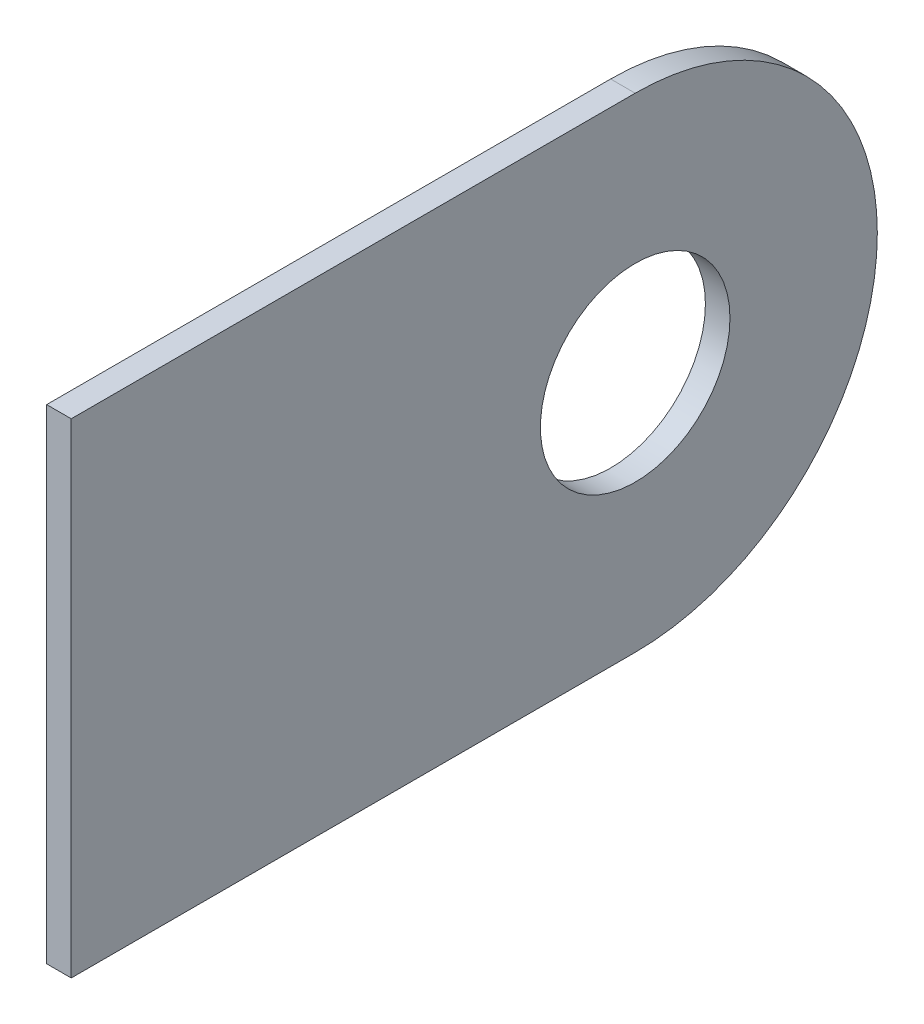
ISO-10303-21;
HEADER;
FILE_DESCRIPTION(('STEP AP214'),'2;1');
FILE_NAME('part.step','',(''),(''),'','','');
FILE_SCHEMA(('AUTOMOTIVE_DESIGN { 1 0 10303 214 1 1 1 1 }'));
ENDSEC;
DATA;
#1=APPLICATION_CONTEXT('core data for automotive mechanical design processes');
#2=APPLICATION_PROTOCOL_DEFINITION('international standard','automotive_design',2000,#1);
#3=PRODUCT_CONTEXT('',#1,'mechanical');
#4=PRODUCT('Part','Part','',(#3));
#5=PRODUCT_RELATED_PRODUCT_CATEGORY('part','',(#4));
#6=PRODUCT_DEFINITION_FORMATION('','',#4);
#7=PRODUCT_DEFINITION_CONTEXT('part definition',#1,'design');
#8=PRODUCT_DEFINITION('design','',#6,#7);
#9=PRODUCT_DEFINITION_SHAPE('','',#8);
#10=(LENGTH_UNIT() NAMED_UNIT(*) SI_UNIT(.MILLI.,.METRE.));
#11=(NAMED_UNIT(*) PLANE_ANGLE_UNIT() SI_UNIT($,.RADIAN.));
#12=(NAMED_UNIT(*) SI_UNIT($,.STERADIAN.) SOLID_ANGLE_UNIT());
#13=UNCERTAINTY_MEASURE_WITH_UNIT(LENGTH_MEASURE(1.E-05),#10,'distance_accuracy_value','');
#14=(GEOMETRIC_REPRESENTATION_CONTEXT(3) GLOBAL_UNCERTAINTY_ASSIGNED_CONTEXT((#13)) GLOBAL_UNIT_ASSIGNED_CONTEXT((#10,
#11,#12)) REPRESENTATION_CONTEXT('',''));
#15=CARTESIAN_POINT('',(0.,0.,0.));
#16=DIRECTION('',(0.,0.,1.));
#17=DIRECTION('',(1.,0.,0.));
#18=AXIS2_PLACEMENT_3D('',#15,#16,#17);
#19=CARTESIAN_POINT('',(-3.125,0.,-10.2017700022388));
#20=DIRECTION('',(1.,0.,0.));
#21=DIRECTION('',(0.,0.,-1.));
#22=AXIS2_PLACEMENT_3D('',#19,#20,#21);
#23=CYLINDRICAL_SURFACE('',#22,36.975);
#24=CARTESIAN_POINT('',(0.625,0.,-10.2017700022388));
#25=DIRECTION('',(1.,0.,0.));
#26=DIRECTION('',(0.,0.,-1.));
#27=AXIS2_PLACEMENT_3D('',#24,#25,#26);
#28=CIRCLE('',#27,36.975);
#29=CARTESIAN_POINT('',(0.625,-36.975,-10.2017700022388));
#30=VERTEX_POINT('',#29);
#31=CARTESIAN_POINT('',(0.625,36.975,-10.2017700022388));
#32=VERTEX_POINT('',#31);
#33=EDGE_CURVE('E101',#30,#32,#28,.T.);
#34=ORIENTED_EDGE('',*,*,#33,.F.);
#35=DIRECTION('',(1.,0.,0.));
#36=VECTOR('',#35,1.);
#37=CARTESIAN_POINT('',(-3.125,-36.975,-10.2017700022388));
#38=LINE('',#37,#36);
#39=CARTESIAN_POINT('',(-3.125,-36.975,-10.2017700022388));
#40=VERTEX_POINT('',#39);
#41=EDGE_CURVE('E11',#40,#30,#38,.T.);
#42=ORIENTED_EDGE('',*,*,#41,.F.);
#43=CARTESIAN_POINT('',(-3.125,0.,-10.2017700022388));
#44=DIRECTION('',(1.,0.,0.));
#45=DIRECTION('',(0.,0.,-1.));
#46=AXIS2_PLACEMENT_3D('',#43,#44,#45);
#47=CIRCLE('',#46,36.975);
#48=CARTESIAN_POINT('',(-3.125,36.975,-10.2017700022388));
#49=VERTEX_POINT('',#48);
#50=EDGE_CURVE('E94',#40,#49,#47,.T.);
#51=ORIENTED_EDGE('',*,*,#50,.T.);
#52=DIRECTION('',(1.,0.,0.));
#53=VECTOR('',#52,1.);
#54=CARTESIAN_POINT('',(-3.125,36.975,-10.2017700022388));
#55=LINE('',#54,#53);
#56=EDGE_CURVE('E39',#49,#32,#55,.T.);
#57=ORIENTED_EDGE('',*,*,#56,.T.);
#58=EDGE_LOOP('',(#34,#42,#51,#57));
#59=FACE_BOUND('',#58,.T.);
#60=ADVANCED_FACE('F36',(#59),#23,.T.);
#61=CARTESIAN_POINT('',(-3.125,-36.975,75.9087899977612));
#62=DIRECTION('',(0.,-1.,0.));
#63=DIRECTION('',(0.,0.,-1.));
#64=AXIS2_PLACEMENT_3D('',#61,#62,#63);
#65=PLANE('',#64);
#66=DIRECTION('',(0.,0.,-1.));
#67=VECTOR('',#66,1.);
#68=CARTESIAN_POINT('',(0.625,-36.975,75.9087899977612));
#69=LINE('',#68,#67);
#70=CARTESIAN_POINT('',(0.625,-36.975,75.9087899977612));
#71=VERTEX_POINT('',#70);
#72=EDGE_CURVE('E96',#71,#30,#69,.T.);
#73=ORIENTED_EDGE('',*,*,#72,.F.);
#74=DIRECTION('',(1.,0.,0.));
#75=VECTOR('',#74,1.);
#76=CARTESIAN_POINT('',(-3.125,-36.975,75.9087899977612));
#77=LINE('',#76,#75);
#78=CARTESIAN_POINT('',(-3.125,-36.975,75.9087899977612));
#79=VERTEX_POINT('',#78);
#80=EDGE_CURVE('E45',#79,#71,#77,.T.);
#81=ORIENTED_EDGE('',*,*,#80,.F.);
#82=DIRECTION('',(0.,0.,-1.));
#83=VECTOR('',#82,1.);
#84=CARTESIAN_POINT('',(-3.125,-36.975,75.9087899977612));
#85=LINE('',#84,#83);
#86=EDGE_CURVE('E91',#79,#40,#85,.T.);
#87=ORIENTED_EDGE('',*,*,#86,.T.);
#88=ORIENTED_EDGE('',*,*,#41,.T.);
#89=EDGE_LOOP('',(#73,#81,#87,#88));
#90=FACE_BOUND('',#89,.T.);
#91=ADVANCED_FACE('F112',(#90),#65,.T.);
#92=CARTESIAN_POINT('',(-3.125,36.975,75.9087899977612));
#93=DIRECTION('',(0.,0.,1.));
#94=DIRECTION('',(1.,0.,0.));
#95=AXIS2_PLACEMENT_3D('',#92,#93,#94);
#96=PLANE('',#95);
#97=DIRECTION('',(0.,-1.,0.));
#98=VECTOR('',#97,1.);
#99=CARTESIAN_POINT('',(0.625,36.975,75.9087899977612));
#100=LINE('',#99,#98);
#101=CARTESIAN_POINT('',(0.625,36.975,75.9087899977612));
#102=VERTEX_POINT('',#101);
#103=EDGE_CURVE('E86',#102,#71,#100,.T.);
#104=ORIENTED_EDGE('',*,*,#103,.F.);
#105=DIRECTION('',(1.,0.,0.));
#106=VECTOR('',#105,1.);
#107=CARTESIAN_POINT('',(-3.125,36.975,75.9087899977612));
#108=LINE('',#107,#106);
#109=CARTESIAN_POINT('',(-3.125,36.975,75.9087899977612));
#110=VERTEX_POINT('',#109);
#111=EDGE_CURVE('E81',#110,#102,#108,.T.);
#112=ORIENTED_EDGE('',*,*,#111,.F.);
#113=DIRECTION('',(0.,-1.,0.));
#114=VECTOR('',#113,1.);
#115=CARTESIAN_POINT('',(-3.125,36.975,75.9087899977612));
#116=LINE('',#115,#114);
#117=EDGE_CURVE('E84',#110,#79,#116,.T.);
#118=ORIENTED_EDGE('',*,*,#117,.T.);
#119=ORIENTED_EDGE('',*,*,#80,.T.);
#120=EDGE_LOOP('',(#104,#112,#118,#119));
#121=FACE_BOUND('',#120,.T.);
#122=ADVANCED_FACE('F83',(#121),#96,.T.);
#123=CARTESIAN_POINT('',(-3.125,36.975,-10.2017700022388));
#124=DIRECTION('',(0.,1.,0.));
#125=DIRECTION('',(0.,0.,1.));
#126=AXIS2_PLACEMENT_3D('',#123,#124,#125);
#127=PLANE('',#126);
#128=DIRECTION('',(0.,0.,1.));
#129=VECTOR('',#128,1.);
#130=CARTESIAN_POINT('',(0.625,36.975,-10.2017700022388));
#131=LINE('',#130,#129);
#132=EDGE_CURVE('E104',#32,#102,#131,.T.);
#133=ORIENTED_EDGE('',*,*,#132,.F.);
#134=ORIENTED_EDGE('',*,*,#56,.F.);
#135=DIRECTION('',(0.,0.,1.));
#136=VECTOR('',#135,1.);
#137=CARTESIAN_POINT('',(-3.125,36.975,-10.2017700022388));
#138=LINE('',#137,#136);
#139=EDGE_CURVE('E90',#49,#110,#138,.T.);
#140=ORIENTED_EDGE('',*,*,#139,.T.);
#141=ORIENTED_EDGE('',*,*,#111,.T.);
#142=EDGE_LOOP('',(#133,#134,#140,#141));
#143=FACE_BOUND('',#142,.T.);
#144=ADVANCED_FACE('F93',(#143),#127,.T.);
#145=CARTESIAN_POINT('',(-3.125,0.,-10.2017700022388));
#146=DIRECTION('',(1.,0.,0.));
#147=DIRECTION('',(0.,0.,-1.));
#148=AXIS2_PLACEMENT_3D('',#145,#146,#147);
#149=PLANE('',#148);
#150=CARTESIAN_POINT('',(-3.125,0.,-10.2017700022388));
#151=DIRECTION('',(1.,0.,0.));
#152=DIRECTION('',(0.,0.,-1.));
#153=AXIS2_PLACEMENT_3D('',#150,#151,#152);
#154=CIRCLE('',#153,14.475);
#155=CARTESIAN_POINT('',(-3.125,0.,-24.6767700022388));
#156=VERTEX_POINT('',#155);
#157=EDGE_CURVE('E105',#156,#156,#154,.T.);
#158=ORIENTED_EDGE('',*,*,#157,.T.);
#159=EDGE_LOOP('',(#158));
#160=FACE_BOUND('',#159,.T.);
#161=ORIENTED_EDGE('',*,*,#50,.F.);
#162=ORIENTED_EDGE('',*,*,#86,.F.);
#163=ORIENTED_EDGE('',*,*,#117,.F.);
#164=ORIENTED_EDGE('',*,*,#139,.F.);
#165=EDGE_LOOP('',(#161,#162,#163,#164));
#166=FACE_BOUND('',#165,.T.);
#167=ADVANCED_FACE('F89',(#160,#166),#149,.F.);
#168=CARTESIAN_POINT('',(0.625,0.,-10.2017700022388));
#169=DIRECTION('',(1.,0.,0.));
#170=DIRECTION('',(0.,0.,-1.));
#171=AXIS2_PLACEMENT_3D('',#168,#169,#170);
#172=PLANE('',#171);
#173=CARTESIAN_POINT('',(0.625,0.,-10.2017700022388));
#174=DIRECTION('',(1.,0.,0.));
#175=DIRECTION('',(0.,0.,-1.));
#176=AXIS2_PLACEMENT_3D('',#173,#174,#175);
#177=CIRCLE('',#176,14.475);
#178=CARTESIAN_POINT('',(0.625,0.,-24.6767700022388));
#179=VERTEX_POINT('',#178);
#180=EDGE_CURVE('E142',#179,#179,#177,.T.);
#181=ORIENTED_EDGE('',*,*,#180,.F.);
#182=EDGE_LOOP('',(#181));
#183=FACE_BOUND('',#182,.T.);
#184=ORIENTED_EDGE('',*,*,#33,.T.);
#185=ORIENTED_EDGE('',*,*,#132,.T.);
#186=ORIENTED_EDGE('',*,*,#103,.T.);
#187=ORIENTED_EDGE('',*,*,#72,.T.);
#188=EDGE_LOOP('',(#184,#185,#186,#187));
#189=FACE_BOUND('',#188,.T.);
#190=ADVANCED_FACE('F111',(#183,#189),#172,.T.);
#191=CARTESIAN_POINT('',(-3.125,0.,-10.2017700022388));
#192=DIRECTION('',(1.,0.,0.));
#193=DIRECTION('',(0.,0.,-1.));
#194=AXIS2_PLACEMENT_3D('',#191,#192,#193);
#195=CYLINDRICAL_SURFACE('',#194,14.475);
#196=ORIENTED_EDGE('',*,*,#157,.F.);
#197=EDGE_LOOP('',(#196));
#198=FACE_BOUND('',#197,.T.);
#199=ORIENTED_EDGE('',*,*,#180,.T.);
#200=EDGE_LOOP('',(#199));
#201=FACE_BOUND('',#200,.T.);
#202=ADVANCED_FACE('F130',(#198,#201),#195,.F.);
#203=CLOSED_SHELL('',(#60,#91,#122,#144,#167,#190,#202));
#204=MANIFOLD_SOLID_BREP('B2',#203);
#205=ADVANCED_BREP_SHAPE_REPRESENTATION('',(#18,#204),#14);
#206=SHAPE_DEFINITION_REPRESENTATION(#9,#205);
ENDSEC;
END-ISO-10303-21;
